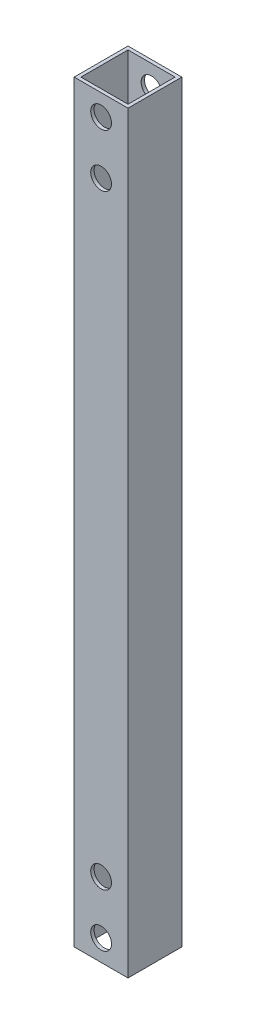
ISO-10303-21;
HEADER;
FILE_DESCRIPTION(('STEP AP214'),'2;1');
FILE_NAME('part.step','',(''),(''),'','','');
FILE_SCHEMA(('AUTOMOTIVE_DESIGN { 1 0 10303 214 1 1 1 1 }'));
ENDSEC;
DATA;
#1=APPLICATION_CONTEXT('core data for automotive mechanical design processes');
#2=APPLICATION_PROTOCOL_DEFINITION('international standard','automotive_design',2000,#1);
#3=PRODUCT_CONTEXT('',#1,'mechanical');
#4=PRODUCT('Part','Part','',(#3));
#5=PRODUCT_RELATED_PRODUCT_CATEGORY('part','',(#4));
#6=PRODUCT_DEFINITION_FORMATION('','',#4);
#7=PRODUCT_DEFINITION_CONTEXT('part definition',#1,'design');
#8=PRODUCT_DEFINITION('design','',#6,#7);
#9=PRODUCT_DEFINITION_SHAPE('','',#8);
#10=(LENGTH_UNIT() NAMED_UNIT(*) SI_UNIT(.MILLI.,.METRE.));
#11=(NAMED_UNIT(*) PLANE_ANGLE_UNIT() SI_UNIT($,.RADIAN.));
#12=(NAMED_UNIT(*) SI_UNIT($,.STERADIAN.) SOLID_ANGLE_UNIT());
#13=UNCERTAINTY_MEASURE_WITH_UNIT(LENGTH_MEASURE(1.E-05),#10,'distance_accuracy_value','');
#14=(GEOMETRIC_REPRESENTATION_CONTEXT(3) GLOBAL_UNCERTAINTY_ASSIGNED_CONTEXT((#13)) GLOBAL_UNIT_ASSIGNED_CONTEXT((#10,
#11,#12)) REPRESENTATION_CONTEXT('',''));
#15=CARTESIAN_POINT('',(0.,0.,0.));
#16=DIRECTION('',(0.,0.,1.));
#17=DIRECTION('',(1.,0.,0.));
#18=AXIS2_PLACEMENT_3D('',#15,#16,#17);
#19=CARTESIAN_POINT('',(0.,355.6,0.));
#20=DIRECTION('',(0.,1.,0.));
#21=DIRECTION('',(0.,0.,1.));
#22=AXIS2_PLACEMENT_3D('',#19,#20,#21);
#23=PLANE('',#22);
#24=DIRECTION('',(0.,0.,-1.));
#25=VECTOR('',#24,1.);
#26=CARTESIAN_POINT('',(12.7,355.6,12.7));
#27=LINE('',#26,#25);
#28=CARTESIAN_POINT('',(12.7,355.6,12.7));
#29=VERTEX_POINT('',#28);
#30=CARTESIAN_POINT('',(12.7,355.6,-12.7));
#31=VERTEX_POINT('',#30);
#32=EDGE_CURVE('E187',#29,#31,#27,.T.);
#33=ORIENTED_EDGE('',*,*,#32,.T.);
#34=DIRECTION('',(-1.,0.,0.));
#35=VECTOR('',#34,1.);
#36=CARTESIAN_POINT('',(-12.7,355.6,-12.7));
#37=LINE('',#36,#35);
#38=CARTESIAN_POINT('',(-12.7,355.6,-12.7));
#39=VERTEX_POINT('',#38);
#40=EDGE_CURVE('E191',#31,#39,#37,.T.);
#41=ORIENTED_EDGE('',*,*,#40,.T.);
#42=DIRECTION('',(0.,0.,1.));
#43=VECTOR('',#42,1.);
#44=CARTESIAN_POINT('',(-12.7,355.6,12.7));
#45=LINE('',#44,#43);
#46=CARTESIAN_POINT('',(-12.7,355.6,12.7));
#47=VERTEX_POINT('',#46);
#48=EDGE_CURVE('E195',#39,#47,#45,.T.);
#49=ORIENTED_EDGE('',*,*,#48,.T.);
#50=DIRECTION('',(1.,0.,0.));
#51=VECTOR('',#50,1.);
#52=CARTESIAN_POINT('',(-12.7,355.6,12.7));
#53=LINE('',#52,#51);
#54=EDGE_CURVE('E198',#47,#29,#53,.T.);
#55=ORIENTED_EDGE('',*,*,#54,.T.);
#56=EDGE_LOOP('',(#33,#41,#49,#55));
#57=FACE_BOUND('',#56,.T.);
#58=DIRECTION('',(-1.,0.,0.));
#59=VECTOR('',#58,1.);
#60=CARTESIAN_POINT('',(0.,355.6,-11.1125));
#61=LINE('',#60,#59);
#62=CARTESIAN_POINT('',(11.1125,355.6,-11.1125));
#63=VERTEX_POINT('',#62);
#64=CARTESIAN_POINT('',(-11.1125,355.6,-11.1125));
#65=VERTEX_POINT('',#64);
#66=EDGE_CURVE('E146',#63,#65,#61,.T.);
#67=ORIENTED_EDGE('',*,*,#66,.F.);
#68=DIRECTION('',(0.,0.,-1.));
#69=VECTOR('',#68,1.);
#70=CARTESIAN_POINT('',(11.1125,355.6,0.));
#71=LINE('',#70,#69);
#72=CARTESIAN_POINT('',(11.1125,355.6,11.1125));
#73=VERTEX_POINT('',#72);
#74=EDGE_CURVE('E137',#73,#63,#71,.T.);
#75=ORIENTED_EDGE('',*,*,#74,.F.);
#76=DIRECTION('',(1.,0.,0.));
#77=VECTOR('',#76,1.);
#78=CARTESIAN_POINT('',(0.,355.6,11.1125));
#79=LINE('',#78,#77);
#80=CARTESIAN_POINT('',(-11.1125,355.6,11.1125));
#81=VERTEX_POINT('',#80);
#82=EDGE_CURVE('E163',#81,#73,#79,.T.);
#83=ORIENTED_EDGE('',*,*,#82,.F.);
#84=DIRECTION('',(0.,0.,1.));
#85=VECTOR('',#84,1.);
#86=CARTESIAN_POINT('',(-11.1125,355.6,0.));
#87=LINE('',#86,#85);
#88=EDGE_CURVE('E159',#65,#81,#87,.T.);
#89=ORIENTED_EDGE('',*,*,#88,.F.);
#90=EDGE_LOOP('',(#67,#75,#83,#89));
#91=FACE_BOUND('',#90,.T.);
#92=ADVANCED_FACE('F69',(#57,#91),#23,.T.);
#93=CARTESIAN_POINT('',(0.,0.,0.));
#94=DIRECTION('',(0.,1.,0.));
#95=DIRECTION('',(0.,0.,1.));
#96=AXIS2_PLACEMENT_3D('',#93,#94,#95);
#97=PLANE('',#96);
#98=DIRECTION('',(0.,0.,-1.));
#99=VECTOR('',#98,1.);
#100=CARTESIAN_POINT('',(12.7,0.,12.7));
#101=LINE('',#100,#99);
#102=CARTESIAN_POINT('',(12.7,0.,12.7));
#103=VERTEX_POINT('',#102);
#104=CARTESIAN_POINT('',(12.7,0.,-12.7));
#105=VERTEX_POINT('',#104);
#106=EDGE_CURVE('E155',#103,#105,#101,.T.);
#107=ORIENTED_EDGE('',*,*,#106,.F.);
#108=DIRECTION('',(1.,0.,0.));
#109=VECTOR('',#108,1.);
#110=CARTESIAN_POINT('',(-12.7,0.,12.7));
#111=LINE('',#110,#109);
#112=CARTESIAN_POINT('',(-12.7,0.,12.7));
#113=VERTEX_POINT('',#112);
#114=EDGE_CURVE('E192',#113,#103,#111,.T.);
#115=ORIENTED_EDGE('',*,*,#114,.F.);
#116=DIRECTION('',(0.,0.,1.));
#117=VECTOR('',#116,1.);
#118=CARTESIAN_POINT('',(-12.7,0.,12.7));
#119=LINE('',#118,#117);
#120=CARTESIAN_POINT('',(-12.7,0.,-12.7));
#121=VERTEX_POINT('',#120);
#122=EDGE_CURVE('E208',#121,#113,#119,.T.);
#123=ORIENTED_EDGE('',*,*,#122,.F.);
#124=DIRECTION('',(-1.,0.,0.));
#125=VECTOR('',#124,1.);
#126=CARTESIAN_POINT('',(-12.7,0.,-12.7));
#127=LINE('',#126,#125);
#128=EDGE_CURVE('E205',#105,#121,#127,.T.);
#129=ORIENTED_EDGE('',*,*,#128,.F.);
#130=EDGE_LOOP('',(#107,#115,#123,#129));
#131=FACE_BOUND('',#130,.T.);
#132=DIRECTION('',(0.,0.,-1.));
#133=VECTOR('',#132,1.);
#134=CARTESIAN_POINT('',(11.1125,0.,0.));
#135=LINE('',#134,#133);
#136=CARTESIAN_POINT('',(11.1125,0.,11.1125));
#137=VERTEX_POINT('',#136);
#138=CARTESIAN_POINT('',(11.1125,0.,-11.1125));
#139=VERTEX_POINT('',#138);
#140=EDGE_CURVE('E95',#137,#139,#135,.T.);
#141=ORIENTED_EDGE('',*,*,#140,.T.);
#142=DIRECTION('',(-1.,0.,0.));
#143=VECTOR('',#142,1.);
#144=CARTESIAN_POINT('',(0.,0.,-11.1125));
#145=LINE('',#144,#143);
#146=CARTESIAN_POINT('',(-11.1125,0.,-11.1125));
#147=VERTEX_POINT('',#146);
#148=EDGE_CURVE('E153',#139,#147,#145,.T.);
#149=ORIENTED_EDGE('',*,*,#148,.T.);
#150=DIRECTION('',(0.,0.,1.));
#151=VECTOR('',#150,1.);
#152=CARTESIAN_POINT('',(-11.1125,0.,0.));
#153=LINE('',#152,#151);
#154=CARTESIAN_POINT('',(-11.1125,0.,11.1125));
#155=VERTEX_POINT('',#154);
#156=EDGE_CURVE('E174',#147,#155,#153,.T.);
#157=ORIENTED_EDGE('',*,*,#156,.T.);
#158=DIRECTION('',(1.,0.,0.));
#159=VECTOR('',#158,1.);
#160=CARTESIAN_POINT('',(0.,0.,11.1125));
#161=LINE('',#160,#159);
#162=EDGE_CURVE('E147',#155,#137,#161,.T.);
#163=ORIENTED_EDGE('',*,*,#162,.T.);
#164=EDGE_LOOP('',(#141,#149,#157,#163));
#165=FACE_BOUND('',#164,.T.);
#166=ADVANCED_FACE('F278',(#131,#165),#97,.F.);
#167=CARTESIAN_POINT('',(12.7,355.6,12.7));
#168=DIRECTION('',(-1.,0.,0.));
#169=DIRECTION('',(0.,0.,1.));
#170=AXIS2_PLACEMENT_3D('',#167,#168,#169);
#171=PLANE('',#170);
#172=ORIENTED_EDGE('',*,*,#106,.T.);
#173=DIRECTION('',(0.,-1.,0.));
#174=VECTOR('',#173,1.);
#175=CARTESIAN_POINT('',(12.7,355.6,-12.7));
#176=LINE('',#175,#174);
#177=EDGE_CURVE('E12',#31,#105,#176,.T.);
#178=ORIENTED_EDGE('',*,*,#177,.F.);
#179=ORIENTED_EDGE('',*,*,#32,.F.);
#180=DIRECTION('',(0.,-1.,0.));
#181=VECTOR('',#180,1.);
#182=CARTESIAN_POINT('',(12.7,355.6,12.7));
#183=LINE('',#182,#181);
#184=EDGE_CURVE('E201',#29,#103,#183,.T.);
#185=ORIENTED_EDGE('',*,*,#184,.T.);
#186=EDGE_LOOP('',(#172,#178,#179,#185));
#187=FACE_BOUND('',#186,.T.);
#188=ADVANCED_FACE('F71',(#187),#171,.F.);
#189=CARTESIAN_POINT('',(-12.7,355.6,-12.7));
#190=DIRECTION('',(0.,0.,1.));
#191=DIRECTION('',(1.,0.,0.));
#192=AXIS2_PLACEMENT_3D('',#189,#190,#191);
#193=PLANE('',#192);
#194=CARTESIAN_POINT('',(0.,345.6,-12.7));
#195=DIRECTION('',(0.,0.,-1.));
#196=DIRECTION('',(-1.,0.,0.));
#197=AXIS2_PLACEMENT_3D('',#194,#195,#196);
#198=CIRCLE('',#197,4.9022);
#199=CARTESIAN_POINT('',(-4.90219999999999,345.6,-12.7));
#200=VERTEX_POINT('',#199);
#201=EDGE_CURVE('E303',#200,#200,#198,.T.);
#202=ORIENTED_EDGE('',*,*,#201,.F.);
#203=EDGE_LOOP('',(#202));
#204=FACE_BOUND('',#203,.T.);
#205=CARTESIAN_POINT('',(0.,320.6,-12.7));
#206=DIRECTION('',(0.,0.,-1.));
#207=DIRECTION('',(-1.,0.,0.));
#208=AXIS2_PLACEMENT_3D('',#205,#206,#207);
#209=CIRCLE('',#208,4.9022);
#210=CARTESIAN_POINT('',(-4.9022,320.6,-12.7));
#211=VERTEX_POINT('',#210);
#212=EDGE_CURVE('E307',#211,#211,#209,.T.);
#213=ORIENTED_EDGE('',*,*,#212,.F.);
#214=EDGE_LOOP('',(#213));
#215=FACE_BOUND('',#214,.T.);
#216=CARTESIAN_POINT('',(0.,35.,-12.7));
#217=DIRECTION('',(0.,0.,-1.));
#218=DIRECTION('',(-1.,0.,0.));
#219=AXIS2_PLACEMENT_3D('',#216,#217,#218);
#220=CIRCLE('',#219,4.9022);
#221=CARTESIAN_POINT('',(-4.90220000000006,35.,-12.7));
#222=VERTEX_POINT('',#221);
#223=EDGE_CURVE('E235',#222,#222,#220,.T.);
#224=ORIENTED_EDGE('',*,*,#223,.F.);
#225=EDGE_LOOP('',(#224));
#226=FACE_BOUND('',#225,.T.);
#227=CARTESIAN_POINT('',(0.,10.,-12.7));
#228=DIRECTION('',(0.,0.,-1.));
#229=DIRECTION('',(-1.,0.,0.));
#230=AXIS2_PLACEMENT_3D('',#227,#228,#229);
#231=CIRCLE('',#230,4.9022);
#232=CARTESIAN_POINT('',(-4.90220000000006,10.,-12.7));
#233=VERTEX_POINT('',#232);
#234=EDGE_CURVE('E232',#233,#233,#231,.T.);
#235=ORIENTED_EDGE('',*,*,#234,.F.);
#236=EDGE_LOOP('',(#235));
#237=FACE_BOUND('',#236,.T.);
#238=ORIENTED_EDGE('',*,*,#128,.T.);
#239=DIRECTION('',(0.,-1.,0.));
#240=VECTOR('',#239,1.);
#241=CARTESIAN_POINT('',(-12.7,355.6,-12.7));
#242=LINE('',#241,#240);
#243=EDGE_CURVE('E79',#39,#121,#242,.T.);
#244=ORIENTED_EDGE('',*,*,#243,.F.);
#245=ORIENTED_EDGE('',*,*,#40,.F.);
#246=ORIENTED_EDGE('',*,*,#177,.T.);
#247=EDGE_LOOP('',(#238,#244,#245,#246));
#248=FACE_BOUND('',#247,.T.);
#249=ADVANCED_FACE('F292',(#204,#215,#226,#237,#248),#193,.F.);
#250=CARTESIAN_POINT('',(-12.7,355.6,12.7));
#251=DIRECTION('',(1.,0.,0.));
#252=DIRECTION('',(0.,0.,-1.));
#253=AXIS2_PLACEMENT_3D('',#250,#251,#252);
#254=PLANE('',#253);
#255=ORIENTED_EDGE('',*,*,#122,.T.);
#256=DIRECTION('',(0.,-1.,0.));
#257=VECTOR('',#256,1.);
#258=CARTESIAN_POINT('',(-12.7,355.6,12.7));
#259=LINE('',#258,#257);
#260=EDGE_CURVE('E216',#47,#113,#259,.T.);
#261=ORIENTED_EDGE('',*,*,#260,.F.);
#262=ORIENTED_EDGE('',*,*,#48,.F.);
#263=ORIENTED_EDGE('',*,*,#243,.T.);
#264=EDGE_LOOP('',(#255,#261,#262,#263));
#265=FACE_BOUND('',#264,.T.);
#266=ADVANCED_FACE('F289',(#265),#254,.F.);
#267=CARTESIAN_POINT('',(-12.7,355.6,12.7));
#268=DIRECTION('',(0.,0.,-1.));
#269=DIRECTION('',(-1.,0.,0.));
#270=AXIS2_PLACEMENT_3D('',#267,#268,#269);
#271=PLANE('',#270);
#272=CARTESIAN_POINT('',(0.,345.6,12.7));
#273=DIRECTION('',(0.,0.,-1.));
#274=DIRECTION('',(-1.,0.,0.));
#275=AXIS2_PLACEMENT_3D('',#272,#273,#274);
#276=CIRCLE('',#275,4.90219999999999);
#277=CARTESIAN_POINT('',(-4.90219999999999,345.6,12.7));
#278=VERTEX_POINT('',#277);
#279=EDGE_CURVE('E361',#278,#278,#276,.T.);
#280=ORIENTED_EDGE('',*,*,#279,.T.);
#281=EDGE_LOOP('',(#280));
#282=FACE_BOUND('',#281,.T.);
#283=CARTESIAN_POINT('',(0.,320.6,12.7));
#284=DIRECTION('',(0.,0.,-1.));
#285=DIRECTION('',(-1.,0.,0.));
#286=AXIS2_PLACEMENT_3D('',#283,#284,#285);
#287=CIRCLE('',#286,4.90219999999999);
#288=CARTESIAN_POINT('',(-4.90219999999999,320.6,12.7));
#289=VERTEX_POINT('',#288);
#290=EDGE_CURVE('E375',#289,#289,#287,.T.);
#291=ORIENTED_EDGE('',*,*,#290,.T.);
#292=EDGE_LOOP('',(#291));
#293=FACE_BOUND('',#292,.T.);
#294=CARTESIAN_POINT('',(0.,35.,12.7));
#295=DIRECTION('',(0.,0.,-1.));
#296=DIRECTION('',(-1.,0.,0.));
#297=AXIS2_PLACEMENT_3D('',#294,#295,#296);
#298=CIRCLE('',#297,4.90219999999999);
#299=CARTESIAN_POINT('',(-4.90220000000005,35.,12.7));
#300=VERTEX_POINT('',#299);
#301=EDGE_CURVE('E226',#300,#300,#298,.T.);
#302=ORIENTED_EDGE('',*,*,#301,.T.);
#303=EDGE_LOOP('',(#302));
#304=FACE_BOUND('',#303,.T.);
#305=CARTESIAN_POINT('',(0.,10.,12.7));
#306=DIRECTION('',(0.,0.,-1.));
#307=DIRECTION('',(-1.,0.,0.));
#308=AXIS2_PLACEMENT_3D('',#305,#306,#307);
#309=CIRCLE('',#308,4.90219999999999);
#310=CARTESIAN_POINT('',(-4.90220000000006,10.,12.7));
#311=VERTEX_POINT('',#310);
#312=EDGE_CURVE('E248',#311,#311,#309,.T.);
#313=ORIENTED_EDGE('',*,*,#312,.T.);
#314=EDGE_LOOP('',(#313));
#315=FACE_BOUND('',#314,.T.);
#316=ORIENTED_EDGE('',*,*,#114,.T.);
#317=ORIENTED_EDGE('',*,*,#184,.F.);
#318=ORIENTED_EDGE('',*,*,#54,.F.);
#319=ORIENTED_EDGE('',*,*,#260,.T.);
#320=EDGE_LOOP('',(#316,#317,#318,#319));
#321=FACE_BOUND('',#320,.T.);
#322=ADVANCED_FACE('F273',(#282,#293,#304,#315,#321),#271,.F.);
#323=CARTESIAN_POINT('',(11.1125,355.6,0.));
#324=DIRECTION('',(-1.,0.,0.));
#325=DIRECTION('',(0.,0.,1.));
#326=AXIS2_PLACEMENT_3D('',#323,#324,#325);
#327=PLANE('',#326);
#328=ORIENTED_EDGE('',*,*,#140,.F.);
#329=DIRECTION('',(0.,-1.,0.));
#330=VECTOR('',#329,1.);
#331=CARTESIAN_POINT('',(11.1125,355.6,11.1125));
#332=LINE('',#331,#330);
#333=EDGE_CURVE('E141',#73,#137,#332,.T.);
#334=ORIENTED_EDGE('',*,*,#333,.F.);
#335=ORIENTED_EDGE('',*,*,#74,.T.);
#336=DIRECTION('',(0.,-1.,0.));
#337=VECTOR('',#336,1.);
#338=CARTESIAN_POINT('',(11.1125,355.6,-11.1125));
#339=LINE('',#338,#337);
#340=EDGE_CURVE('E140',#63,#139,#339,.T.);
#341=ORIENTED_EDGE('',*,*,#340,.T.);
#342=EDGE_LOOP('',(#328,#334,#335,#341));
#343=FACE_BOUND('',#342,.T.);
#344=ADVANCED_FACE('F139',(#343),#327,.T.);
#345=CARTESIAN_POINT('',(0.,355.6,-11.1125));
#346=DIRECTION('',(0.,0.,1.));
#347=DIRECTION('',(1.,0.,0.));
#348=AXIS2_PLACEMENT_3D('',#345,#346,#347);
#349=PLANE('',#348);
#350=CARTESIAN_POINT('',(0.,345.6,-11.1125));
#351=DIRECTION('',(0.,0.,1.));
#352=DIRECTION('',(1.,0.,0.));
#353=AXIS2_PLACEMENT_3D('',#350,#351,#352);
#354=CIRCLE('',#353,4.9022);
#355=CARTESIAN_POINT('',(4.9022,345.6,-11.1125));
#356=VERTEX_POINT('',#355);
#357=EDGE_CURVE('E366',#356,#356,#354,.T.);
#358=ORIENTED_EDGE('',*,*,#357,.F.);
#359=EDGE_LOOP('',(#358));
#360=FACE_BOUND('',#359,.T.);
#361=CARTESIAN_POINT('',(0.,320.6,-11.1125));
#362=DIRECTION('',(0.,0.,1.));
#363=DIRECTION('',(1.,0.,0.));
#364=AXIS2_PLACEMENT_3D('',#361,#362,#363);
#365=CIRCLE('',#364,4.9022);
#366=CARTESIAN_POINT('',(4.9022,320.6,-11.1125));
#367=VERTEX_POINT('',#366);
#368=EDGE_CURVE('E241',#367,#367,#365,.T.);
#369=ORIENTED_EDGE('',*,*,#368,.F.);
#370=EDGE_LOOP('',(#369));
#371=FACE_BOUND('',#370,.T.);
#372=CARTESIAN_POINT('',(0.,35.,-11.1125));
#373=DIRECTION('',(0.,0.,1.));
#374=DIRECTION('',(1.,0.,0.));
#375=AXIS2_PLACEMENT_3D('',#372,#373,#374);
#376=CIRCLE('',#375,4.9022);
#377=CARTESIAN_POINT('',(4.90219999999993,35.,-11.1125));
#378=VERTEX_POINT('',#377);
#379=EDGE_CURVE('E222',#378,#378,#376,.T.);
#380=ORIENTED_EDGE('',*,*,#379,.F.);
#381=EDGE_LOOP('',(#380));
#382=FACE_BOUND('',#381,.T.);
#383=CARTESIAN_POINT('',(0.,10.,-11.1125));
#384=DIRECTION('',(0.,0.,1.));
#385=DIRECTION('',(1.,0.,0.));
#386=AXIS2_PLACEMENT_3D('',#383,#384,#385);
#387=CIRCLE('',#386,4.9022);
#388=CARTESIAN_POINT('',(4.90219999999993,10.,-11.1125));
#389=VERTEX_POINT('',#388);
#390=EDGE_CURVE('E171',#389,#389,#387,.T.);
#391=ORIENTED_EDGE('',*,*,#390,.F.);
#392=EDGE_LOOP('',(#391));
#393=FACE_BOUND('',#392,.T.);
#394=ORIENTED_EDGE('',*,*,#148,.F.);
#395=ORIENTED_EDGE('',*,*,#340,.F.);
#396=ORIENTED_EDGE('',*,*,#66,.T.);
#397=DIRECTION('',(0.,-1.,0.));
#398=VECTOR('',#397,1.);
#399=CARTESIAN_POINT('',(-11.1125,355.6,-11.1125));
#400=LINE('',#399,#398);
#401=EDGE_CURVE('E156',#65,#147,#400,.T.);
#402=ORIENTED_EDGE('',*,*,#401,.T.);
#403=EDGE_LOOP('',(#394,#395,#396,#402));
#404=FACE_BOUND('',#403,.T.);
#405=ADVANCED_FACE('F150',(#360,#371,#382,#393,#404),#349,.T.);
#406=CARTESIAN_POINT('',(-11.1125,355.6,0.));
#407=DIRECTION('',(1.,0.,0.));
#408=DIRECTION('',(0.,0.,-1.));
#409=AXIS2_PLACEMENT_3D('',#406,#407,#408);
#410=PLANE('',#409);
#411=ORIENTED_EDGE('',*,*,#156,.F.);
#412=ORIENTED_EDGE('',*,*,#401,.F.);
#413=ORIENTED_EDGE('',*,*,#88,.T.);
#414=DIRECTION('',(0.,-1.,0.));
#415=VECTOR('',#414,1.);
#416=CARTESIAN_POINT('',(-11.1125,355.6,11.1125));
#417=LINE('',#416,#415);
#418=EDGE_CURVE('E87',#81,#155,#417,.T.);
#419=ORIENTED_EDGE('',*,*,#418,.T.);
#420=EDGE_LOOP('',(#411,#412,#413,#419));
#421=FACE_BOUND('',#420,.T.);
#422=ADVANCED_FACE('F263',(#421),#410,.T.);
#423=CARTESIAN_POINT('',(0.,355.6,11.1125));
#424=DIRECTION('',(0.,0.,-1.));
#425=DIRECTION('',(-1.,0.,0.));
#426=AXIS2_PLACEMENT_3D('',#423,#424,#425);
#427=PLANE('',#426);
#428=CARTESIAN_POINT('',(0.,345.6,11.1125));
#429=DIRECTION('',(0.,0.,-1.));
#430=DIRECTION('',(-1.,0.,0.));
#431=AXIS2_PLACEMENT_3D('',#428,#429,#430);
#432=CIRCLE('',#431,4.9022);
#433=CARTESIAN_POINT('',(-4.90219999999999,345.6,11.1125));
#434=VERTEX_POINT('',#433);
#435=EDGE_CURVE('E358',#434,#434,#432,.T.);
#436=ORIENTED_EDGE('',*,*,#435,.F.);
#437=EDGE_LOOP('',(#436));
#438=FACE_BOUND('',#437,.T.);
#439=CARTESIAN_POINT('',(0.,320.6,11.1125));
#440=DIRECTION('',(0.,0.,-1.));
#441=DIRECTION('',(-1.,0.,0.));
#442=AXIS2_PLACEMENT_3D('',#439,#440,#441);
#443=CIRCLE('',#442,4.9022);
#444=CARTESIAN_POINT('',(-4.90219999999999,320.6,11.1125));
#445=VERTEX_POINT('',#444);
#446=EDGE_CURVE('E73',#445,#445,#443,.T.);
#447=ORIENTED_EDGE('',*,*,#446,.F.);
#448=EDGE_LOOP('',(#447));
#449=FACE_BOUND('',#448,.T.);
#450=CARTESIAN_POINT('',(0.,35.,11.1125));
#451=DIRECTION('',(0.,0.,-1.));
#452=DIRECTION('',(-1.,0.,0.));
#453=AXIS2_PLACEMENT_3D('',#450,#451,#452);
#454=CIRCLE('',#453,4.9022);
#455=CARTESIAN_POINT('',(-4.90220000000006,35.,11.1125));
#456=VERTEX_POINT('',#455);
#457=EDGE_CURVE('E225',#456,#456,#454,.T.);
#458=ORIENTED_EDGE('',*,*,#457,.F.);
#459=EDGE_LOOP('',(#458));
#460=FACE_BOUND('',#459,.T.);
#461=CARTESIAN_POINT('',(0.,10.,11.1125));
#462=DIRECTION('',(0.,0.,-1.));
#463=DIRECTION('',(-1.,0.,0.));
#464=AXIS2_PLACEMENT_3D('',#461,#462,#463);
#465=CIRCLE('',#464,4.9022);
#466=CARTESIAN_POINT('',(-4.90220000000006,10.,11.1125));
#467=VERTEX_POINT('',#466);
#468=EDGE_CURVE('E252',#467,#467,#465,.T.);
#469=ORIENTED_EDGE('',*,*,#468,.F.);
#470=EDGE_LOOP('',(#469));
#471=FACE_BOUND('',#470,.T.);
#472=ORIENTED_EDGE('',*,*,#162,.F.);
#473=ORIENTED_EDGE('',*,*,#418,.F.);
#474=ORIENTED_EDGE('',*,*,#82,.T.);
#475=ORIENTED_EDGE('',*,*,#333,.T.);
#476=EDGE_LOOP('',(#472,#473,#474,#475));
#477=FACE_BOUND('',#476,.T.);
#478=ADVANCED_FACE('F270',(#438,#449,#460,#471,#477),#427,.T.);
#479=CARTESIAN_POINT('',(0.,10.,-12.7));
#480=DIRECTION('',(0.,0.,-1.));
#481=DIRECTION('',(-1.,0.,0.));
#482=AXIS2_PLACEMENT_3D('',#479,#480,#481);
#483=CYLINDRICAL_SURFACE('',#482,4.9022);
#484=ORIENTED_EDGE('',*,*,#468,.T.);
#485=EDGE_LOOP('',(#484));
#486=FACE_BOUND('',#485,.T.);
#487=ORIENTED_EDGE('',*,*,#312,.F.);
#488=EDGE_LOOP('',(#487));
#489=FACE_BOUND('',#488,.T.);
#490=ADVANCED_FACE('F326',(#486,#489),#483,.F.);
#491=ORIENTED_EDGE('',*,*,#390,.T.);
#492=EDGE_LOOP('',(#491));
#493=FACE_BOUND('',#492,.T.);
#494=ORIENTED_EDGE('',*,*,#234,.T.);
#495=EDGE_LOOP('',(#494));
#496=FACE_BOUND('',#495,.T.);
#497=ADVANCED_FACE('F259',(#493,#496),#483,.F.);
#498=CARTESIAN_POINT('',(0.,35.,-12.7));
#499=DIRECTION('',(0.,0.,-1.));
#500=DIRECTION('',(-1.,0.,0.));
#501=AXIS2_PLACEMENT_3D('',#498,#499,#500);
#502=CYLINDRICAL_SURFACE('',#501,4.9022);
#503=ORIENTED_EDGE('',*,*,#379,.T.);
#504=EDGE_LOOP('',(#503));
#505=FACE_BOUND('',#504,.T.);
#506=ORIENTED_EDGE('',*,*,#223,.T.);
#507=EDGE_LOOP('',(#506));
#508=FACE_BOUND('',#507,.T.);
#509=ADVANCED_FACE('F337',(#505,#508),#502,.F.);
#510=ORIENTED_EDGE('',*,*,#457,.T.);
#511=EDGE_LOOP('',(#510));
#512=FACE_BOUND('',#511,.T.);
#513=ORIENTED_EDGE('',*,*,#301,.F.);
#514=EDGE_LOOP('',(#513));
#515=FACE_BOUND('',#514,.T.);
#516=ADVANCED_FACE('F340',(#512,#515),#502,.F.);
#517=CARTESIAN_POINT('',(0.,320.6,-12.7));
#518=DIRECTION('',(0.,0.,-1.));
#519=DIRECTION('',(-1.,0.,0.));
#520=AXIS2_PLACEMENT_3D('',#517,#518,#519);
#521=CYLINDRICAL_SURFACE('',#520,4.9022);
#522=ORIENTED_EDGE('',*,*,#446,.T.);
#523=EDGE_LOOP('',(#522));
#524=FACE_BOUND('',#523,.T.);
#525=ORIENTED_EDGE('',*,*,#290,.F.);
#526=EDGE_LOOP('',(#525));
#527=FACE_BOUND('',#526,.T.);
#528=ADVANCED_FACE('F341',(#524,#527),#521,.F.);
#529=ORIENTED_EDGE('',*,*,#368,.T.);
#530=EDGE_LOOP('',(#529));
#531=FACE_BOUND('',#530,.T.);
#532=ORIENTED_EDGE('',*,*,#212,.T.);
#533=EDGE_LOOP('',(#532));
#534=FACE_BOUND('',#533,.T.);
#535=ADVANCED_FACE('F344',(#531,#534),#521,.F.);
#536=CARTESIAN_POINT('',(0.,345.6,-12.7));
#537=DIRECTION('',(0.,0.,-1.));
#538=DIRECTION('',(-1.,0.,0.));
#539=AXIS2_PLACEMENT_3D('',#536,#537,#538);
#540=CYLINDRICAL_SURFACE('',#539,4.9022);
#541=ORIENTED_EDGE('',*,*,#435,.T.);
#542=EDGE_LOOP('',(#541));
#543=FACE_BOUND('',#542,.T.);
#544=ORIENTED_EDGE('',*,*,#279,.F.);
#545=EDGE_LOOP('',(#544));
#546=FACE_BOUND('',#545,.T.);
#547=ADVANCED_FACE('F346',(#543,#546),#540,.F.);
#548=ORIENTED_EDGE('',*,*,#357,.T.);
#549=EDGE_LOOP('',(#548));
#550=FACE_BOUND('',#549,.T.);
#551=ORIENTED_EDGE('',*,*,#201,.T.);
#552=EDGE_LOOP('',(#551));
#553=FACE_BOUND('',#552,.T.);
#554=ADVANCED_FACE('F348',(#550,#553),#540,.F.);
#555=CLOSED_SHELL('',(#92,#166,#188,#249,#266,#322,#344,#405,#422,#478,#490,#497,#509,#516,#528,
#535,#547,#554));
#556=MANIFOLD_SOLID_BREP('B2',#555);
#557=ADVANCED_BREP_SHAPE_REPRESENTATION('',(#18,#556),#14);
#558=SHAPE_DEFINITION_REPRESENTATION(#9,#557);
ENDSEC;
END-ISO-10303-21;
